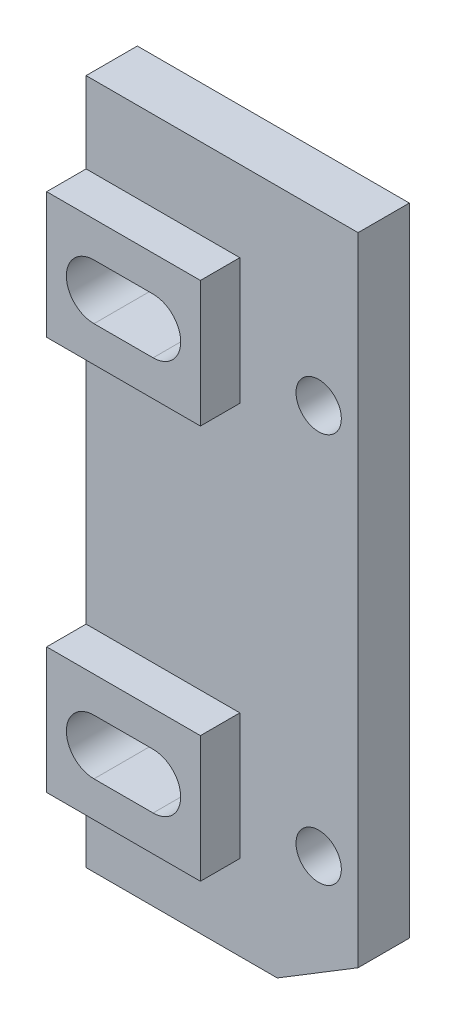
ISO-10303-21;
HEADER;
FILE_DESCRIPTION(('STEP AP214'),'2;1');
FILE_NAME('part.step','',(''),(''),'','','');
FILE_SCHEMA(('AUTOMOTIVE_DESIGN { 1 0 10303 214 1 1 1 1 }'));
ENDSEC;
DATA;
#1=APPLICATION_CONTEXT('core data for automotive mechanical design processes');
#2=APPLICATION_PROTOCOL_DEFINITION('international standard','automotive_design',2000,#1);
#3=PRODUCT_CONTEXT('',#1,'mechanical');
#4=PRODUCT('Part','Part','',(#3));
#5=PRODUCT_RELATED_PRODUCT_CATEGORY('part','',(#4));
#6=PRODUCT_DEFINITION_FORMATION('','',#4);
#7=PRODUCT_DEFINITION_CONTEXT('part definition',#1,'design');
#8=PRODUCT_DEFINITION('design','',#6,#7);
#9=PRODUCT_DEFINITION_SHAPE('','',#8);
#10=(LENGTH_UNIT() NAMED_UNIT(*) SI_UNIT(.MILLI.,.METRE.));
#11=(NAMED_UNIT(*) PLANE_ANGLE_UNIT() SI_UNIT($,.RADIAN.));
#12=(NAMED_UNIT(*) SI_UNIT($,.STERADIAN.) SOLID_ANGLE_UNIT());
#13=UNCERTAINTY_MEASURE_WITH_UNIT(LENGTH_MEASURE(1.E-05),#10,'distance_accuracy_value','');
#14=(GEOMETRIC_REPRESENTATION_CONTEXT(3) GLOBAL_UNCERTAINTY_ASSIGNED_CONTEXT((#13)) GLOBAL_UNIT_ASSIGNED_CONTEXT((#10,
#11,#12)) REPRESENTATION_CONTEXT('',''));
#15=CARTESIAN_POINT('',(0.,0.,0.));
#16=DIRECTION('',(0.,0.,1.));
#17=DIRECTION('',(1.,0.,0.));
#18=AXIS2_PLACEMENT_3D('',#15,#16,#17);
#19=CARTESIAN_POINT('',(0.,0.,2.6));
#20=DIRECTION('',(0.,0.,1.));
#21=DIRECTION('',(1.,0.,0.));
#22=AXIS2_PLACEMENT_3D('',#19,#20,#21);
#23=PLANE('',#22);
#24=CARTESIAN_POINT('',(36.8,2.2,2.6));
#25=DIRECTION('',(0.,0.,1.));
#26=DIRECTION('',(1.,0.,0.));
#27=AXIS2_PLACEMENT_3D('',#24,#25,#26);
#28=CIRCLE('',#27,1.15);
#29=CARTESIAN_POINT('',(37.95,2.2,2.6));
#30=VERTEX_POINT('',#29);
#31=EDGE_CURVE('E299',#30,#30,#28,.T.);
#32=ORIENTED_EDGE('',*,*,#31,.F.);
#33=EDGE_LOOP('',(#32));
#34=FACE_BOUND('',#33,.T.);
#35=CARTESIAN_POINT('',(36.8,-17.6,2.6));
#36=DIRECTION('',(0.,0.,1.));
#37=DIRECTION('',(1.,0.,0.));
#38=AXIS2_PLACEMENT_3D('',#35,#36,#37);
#39=CIRCLE('',#38,1.15);
#40=CARTESIAN_POINT('',(37.95,-17.6,2.6));
#41=VERTEX_POINT('',#40);
#42=EDGE_CURVE('E305',#41,#41,#39,.T.);
#43=ORIENTED_EDGE('',*,*,#42,.F.);
#44=EDGE_LOOP('',(#43));
#45=FACE_BOUND('',#44,.T.);
#46=DIRECTION('',(0.,1.,0.));
#47=VECTOR('',#46,1.);
#48=CARTESIAN_POINT('',(32.8,0.3,2.6));
#49=LINE('',#48,#47);
#50=CARTESIAN_POINT('',(32.8,0.3,2.6));
#51=VERTEX_POINT('',#50);
#52=CARTESIAN_POINT('',(32.8,6.7,2.6));
#53=VERTEX_POINT('',#52);
#54=EDGE_CURVE('E58',#51,#53,#49,.T.);
#55=ORIENTED_EDGE('',*,*,#54,.F.);
#56=DIRECTION('',(1.,0.,0.));
#57=VECTOR('',#56,1.);
#58=CARTESIAN_POINT('',(25.,0.3,2.6));
#59=LINE('',#58,#57);
#60=CARTESIAN_POINT('',(25.,0.3,2.6));
#61=VERTEX_POINT('',#60);
#62=EDGE_CURVE('E211',#61,#51,#59,.T.);
#63=ORIENTED_EDGE('',*,*,#62,.F.);
#64=DIRECTION('',(0.,-1.,0.));
#65=VECTOR('',#64,1.);
#66=CARTESIAN_POINT('',(25.,10.8,2.6));
#67=LINE('',#66,#65);
#68=CARTESIAN_POINT('',(25.,-13.3,2.6));
#69=VERTEX_POINT('',#68);
#70=EDGE_CURVE('E314',#61,#69,#67,.T.);
#71=ORIENTED_EDGE('',*,*,#70,.T.);
#72=DIRECTION('',(-1.,0.,0.));
#73=VECTOR('',#72,1.);
#74=CARTESIAN_POINT('',(32.8,-13.3,2.6));
#75=LINE('',#74,#73);
#76=CARTESIAN_POINT('',(32.8,-13.3,2.6));
#77=VERTEX_POINT('',#76);
#78=EDGE_CURVE('E237',#77,#69,#75,.T.);
#79=ORIENTED_EDGE('',*,*,#78,.F.);
#80=DIRECTION('',(0.,1.,0.));
#81=VECTOR('',#80,1.);
#82=CARTESIAN_POINT('',(32.8,-19.7,2.6));
#83=LINE('',#82,#81);
#84=CARTESIAN_POINT('',(32.8,-19.7,2.6));
#85=VERTEX_POINT('',#84);
#86=EDGE_CURVE('E246',#85,#77,#83,.T.);
#87=ORIENTED_EDGE('',*,*,#86,.F.);
#88=DIRECTION('',(1.,0.,0.));
#89=VECTOR('',#88,1.);
#90=CARTESIAN_POINT('',(25.,-19.7,2.6));
#91=LINE('',#90,#89);
#92=CARTESIAN_POINT('',(25.,-19.7,2.6));
#93=VERTEX_POINT('',#92);
#94=EDGE_CURVE('E232',#93,#85,#91,.T.);
#95=ORIENTED_EDGE('',*,*,#94,.F.);
#96=CARTESIAN_POINT('',(25.,-24.,2.6));
#97=VERTEX_POINT('',#96);
#98=EDGE_CURVE('E315',#93,#97,#67,.T.);
#99=ORIENTED_EDGE('',*,*,#98,.T.);
#100=DIRECTION('',(1.,0.,0.));
#101=VECTOR('',#100,1.);
#102=CARTESIAN_POINT('',(25.,-24.,2.6));
#103=LINE('',#102,#101);
#104=CARTESIAN_POINT('',(34.7,-24.,2.6));
#105=VERTEX_POINT('',#104);
#106=EDGE_CURVE('E313',#97,#105,#103,.T.);
#107=ORIENTED_EDGE('',*,*,#106,.T.);
#108=DIRECTION('',(0.853796175794035,0.520607424264657,0.));
#109=VECTOR('',#108,1.);
#110=CARTESIAN_POINT('',(34.7,-24.,2.6));
#111=LINE('',#110,#109);
#112=CARTESIAN_POINT('',(38.8,-21.5,2.6));
#113=VERTEX_POINT('',#112);
#114=EDGE_CURVE('E317',#105,#113,#111,.T.);
#115=ORIENTED_EDGE('',*,*,#114,.T.);
#116=DIRECTION('',(0.,1.,0.));
#117=VECTOR('',#116,1.);
#118=CARTESIAN_POINT('',(38.8,-21.5,2.6));
#119=LINE('',#118,#117);
#120=CARTESIAN_POINT('',(38.8,10.8,2.6));
#121=VERTEX_POINT('',#120);
#122=EDGE_CURVE('E319',#113,#121,#119,.T.);
#123=ORIENTED_EDGE('',*,*,#122,.T.);
#124=DIRECTION('',(-1.,0.,0.));
#125=VECTOR('',#124,1.);
#126=CARTESIAN_POINT('',(38.8,10.8,2.6));
#127=LINE('',#126,#125);
#128=CARTESIAN_POINT('',(25.,10.8,2.6));
#129=VERTEX_POINT('',#128);
#130=EDGE_CURVE('E321',#121,#129,#127,.T.);
#131=ORIENTED_EDGE('',*,*,#130,.T.);
#132=CARTESIAN_POINT('',(25.,6.7,2.6));
#133=VERTEX_POINT('',#132);
#134=EDGE_CURVE('E311',#129,#133,#67,.T.);
#135=ORIENTED_EDGE('',*,*,#134,.T.);
#136=DIRECTION('',(-1.,0.,0.));
#137=VECTOR('',#136,1.);
#138=CARTESIAN_POINT('',(32.8,6.7,2.6));
#139=LINE('',#138,#137);
#140=EDGE_CURVE('E63',#53,#133,#139,.T.);
#141=ORIENTED_EDGE('',*,*,#140,.F.);
#142=EDGE_LOOP('',(#55,#63,#71,#79,#87,#95,#99,#107,#115,#123,#131,#135,#141));
#143=FACE_BOUND('',#142,.T.);
#144=ADVANCED_FACE('F43',(#34,#45,#143),#23,.T.);
#145=CARTESIAN_POINT('',(0.,0.,0.));
#146=DIRECTION('',(0.,0.,1.));
#147=DIRECTION('',(1.,0.,0.));
#148=AXIS2_PLACEMENT_3D('',#145,#146,#147);
#149=PLANE('',#148);
#150=CARTESIAN_POINT('',(27.4,-16.5,0.));
#151=DIRECTION('',(0.,0.,1.));
#152=DIRECTION('',(1.,0.,0.));
#153=AXIS2_PLACEMENT_3D('',#150,#151,#152);
#154=CIRCLE('',#153,1.4);
#155=CARTESIAN_POINT('',(27.4,-15.1,0.));
#156=VERTEX_POINT('',#155);
#157=CARTESIAN_POINT('',(27.4,-17.9,0.));
#158=VERTEX_POINT('',#157);
#159=EDGE_CURVE('E276',#156,#158,#154,.T.);
#160=ORIENTED_EDGE('',*,*,#159,.T.);
#161=DIRECTION('',(1.,0.,0.));
#162=VECTOR('',#161,1.);
#163=CARTESIAN_POINT('',(27.4,-17.9,0.));
#164=LINE('',#163,#162);
#165=CARTESIAN_POINT('',(30.4,-17.9,0.));
#166=VERTEX_POINT('',#165);
#167=EDGE_CURVE('E279',#158,#166,#164,.T.);
#168=ORIENTED_EDGE('',*,*,#167,.T.);
#169=CARTESIAN_POINT('',(30.4,-16.5,0.));
#170=DIRECTION('',(0.,0.,1.));
#171=DIRECTION('',(1.,0.,0.));
#172=AXIS2_PLACEMENT_3D('',#169,#170,#171);
#173=CIRCLE('',#172,1.4);
#174=CARTESIAN_POINT('',(30.4,-15.1,0.));
#175=VERTEX_POINT('',#174);
#176=EDGE_CURVE('E282',#166,#175,#173,.T.);
#177=ORIENTED_EDGE('',*,*,#176,.T.);
#178=DIRECTION('',(-1.,0.,0.));
#179=VECTOR('',#178,1.);
#180=CARTESIAN_POINT('',(30.4,-15.1,0.));
#181=LINE('',#180,#179);
#182=EDGE_CURVE('E285',#175,#156,#181,.T.);
#183=ORIENTED_EDGE('',*,*,#182,.T.);
#184=EDGE_LOOP('',(#160,#168,#177,#183));
#185=FACE_BOUND('',#184,.T.);
#186=DIRECTION('',(0.,-1.,0.));
#187=VECTOR('',#186,1.);
#188=CARTESIAN_POINT('',(25.,10.8,0.));
#189=LINE('',#188,#187);
#190=CARTESIAN_POINT('',(25.,10.8,0.));
#191=VERTEX_POINT('',#190);
#192=CARTESIAN_POINT('',(25.,-24.,0.));
#193=VERTEX_POINT('',#192);
#194=EDGE_CURVE('E308',#191,#193,#189,.T.);
#195=ORIENTED_EDGE('',*,*,#194,.F.);
#196=DIRECTION('',(-1.,0.,0.));
#197=VECTOR('',#196,1.);
#198=CARTESIAN_POINT('',(38.8,10.8,0.));
#199=LINE('',#198,#197);
#200=CARTESIAN_POINT('',(38.8,10.8,0.));
#201=VERTEX_POINT('',#200);
#202=EDGE_CURVE('E332',#201,#191,#199,.T.);
#203=ORIENTED_EDGE('',*,*,#202,.F.);
#204=DIRECTION('',(0.,1.,0.));
#205=VECTOR('',#204,1.);
#206=CARTESIAN_POINT('',(38.8,-21.5,0.));
#207=LINE('',#206,#205);
#208=CARTESIAN_POINT('',(38.8,-21.5,0.));
#209=VERTEX_POINT('',#208);
#210=EDGE_CURVE('E330',#209,#201,#207,.T.);
#211=ORIENTED_EDGE('',*,*,#210,.F.);
#212=DIRECTION('',(0.853796175794035,0.520607424264657,0.));
#213=VECTOR('',#212,1.);
#214=CARTESIAN_POINT('',(34.7,-24.,0.));
#215=LINE('',#214,#213);
#216=CARTESIAN_POINT('',(34.7,-24.,0.));
#217=VERTEX_POINT('',#216);
#218=EDGE_CURVE('E328',#217,#209,#215,.T.);
#219=ORIENTED_EDGE('',*,*,#218,.F.);
#220=DIRECTION('',(1.,0.,0.));
#221=VECTOR('',#220,1.);
#222=CARTESIAN_POINT('',(25.,-24.,0.));
#223=LINE('',#222,#221);
#224=EDGE_CURVE('E326',#193,#217,#223,.T.);
#225=ORIENTED_EDGE('',*,*,#224,.F.);
#226=EDGE_LOOP('',(#195,#203,#211,#219,#225));
#227=FACE_BOUND('',#226,.T.);
#228=CARTESIAN_POINT('',(36.8,-17.6,0.));
#229=DIRECTION('',(0.,0.,1.));
#230=DIRECTION('',(1.,0.,0.));
#231=AXIS2_PLACEMENT_3D('',#228,#229,#230);
#232=CIRCLE('',#231,1.15);
#233=CARTESIAN_POINT('',(37.95,-17.6,0.));
#234=VERTEX_POINT('',#233);
#235=EDGE_CURVE('E302',#234,#234,#232,.T.);
#236=ORIENTED_EDGE('',*,*,#235,.T.);
#237=EDGE_LOOP('',(#236));
#238=FACE_BOUND('',#237,.T.);
#239=CARTESIAN_POINT('',(36.8,2.2,0.));
#240=DIRECTION('',(0.,0.,1.));
#241=DIRECTION('',(1.,0.,0.));
#242=AXIS2_PLACEMENT_3D('',#239,#240,#241);
#243=CIRCLE('',#242,1.15);
#244=CARTESIAN_POINT('',(37.95,2.2,0.));
#245=VERTEX_POINT('',#244);
#246=EDGE_CURVE('E298',#245,#245,#243,.T.);
#247=ORIENTED_EDGE('',*,*,#246,.T.);
#248=EDGE_LOOP('',(#247));
#249=FACE_BOUND('',#248,.T.);
#250=CARTESIAN_POINT('',(27.4,3.5,0.));
#251=DIRECTION('',(0.,0.,1.));
#252=DIRECTION('',(1.,0.,0.));
#253=AXIS2_PLACEMENT_3D('',#250,#251,#252);
#254=CIRCLE('',#253,1.4);
#255=CARTESIAN_POINT('',(27.4,4.9,0.));
#256=VERTEX_POINT('',#255);
#257=CARTESIAN_POINT('',(27.4,2.1,0.));
#258=VERTEX_POINT('',#257);
#259=EDGE_CURVE('E262',#256,#258,#254,.T.);
#260=ORIENTED_EDGE('',*,*,#259,.T.);
#261=DIRECTION('',(1.,0.,0.));
#262=VECTOR('',#261,1.);
#263=CARTESIAN_POINT('',(27.4,2.1,0.));
#264=LINE('',#263,#262);
#265=CARTESIAN_POINT('',(30.4,2.1,0.));
#266=VERTEX_POINT('',#265);
#267=EDGE_CURVE('E265',#258,#266,#264,.T.);
#268=ORIENTED_EDGE('',*,*,#267,.T.);
#269=CARTESIAN_POINT('',(30.4,3.5,0.));
#270=DIRECTION('',(0.,0.,1.));
#271=DIRECTION('',(1.,0.,0.));
#272=AXIS2_PLACEMENT_3D('',#269,#270,#271);
#273=CIRCLE('',#272,1.4);
#274=CARTESIAN_POINT('',(30.4,4.9,0.));
#275=VERTEX_POINT('',#274);
#276=EDGE_CURVE('E268',#266,#275,#273,.T.);
#277=ORIENTED_EDGE('',*,*,#276,.T.);
#278=DIRECTION('',(-1.,0.,0.));
#279=VECTOR('',#278,1.);
#280=CARTESIAN_POINT('',(30.4,4.9,0.));
#281=LINE('',#280,#279);
#282=EDGE_CURVE('E193',#275,#256,#281,.T.);
#283=ORIENTED_EDGE('',*,*,#282,.T.);
#284=EDGE_LOOP('',(#260,#268,#277,#283));
#285=FACE_BOUND('',#284,.T.);
#286=ADVANCED_FACE('F353',(#185,#227,#238,#249,#285),#149,.F.);
#287=CARTESIAN_POINT('',(25.,10.8,2.6));
#288=DIRECTION('',(1.,0.,0.));
#289=DIRECTION('',(0.,0.,-1.));
#290=AXIS2_PLACEMENT_3D('',#287,#288,#289);
#291=PLANE('',#290);
#292=ORIENTED_EDGE('',*,*,#194,.T.);
#293=DIRECTION('',(0.,0.,-1.));
#294=VECTOR('',#293,1.);
#295=CARTESIAN_POINT('',(25.,-24.,2.6));
#296=LINE('',#295,#294);
#297=EDGE_CURVE('E11',#97,#193,#296,.T.);
#298=ORIENTED_EDGE('',*,*,#297,.F.);
#299=ORIENTED_EDGE('',*,*,#98,.F.);
#300=DIRECTION('',(0.,0.,-1.));
#301=VECTOR('',#300,1.);
#302=CARTESIAN_POINT('',(25.,-19.7,4.6));
#303=LINE('',#302,#301);
#304=CARTESIAN_POINT('',(25.,-19.7,4.6));
#305=VERTEX_POINT('',#304);
#306=EDGE_CURVE('E259',#305,#93,#303,.T.);
#307=ORIENTED_EDGE('',*,*,#306,.F.);
#308=DIRECTION('',(0.,-1.,0.));
#309=VECTOR('',#308,1.);
#310=CARTESIAN_POINT('',(25.,-13.3,4.6));
#311=LINE('',#310,#309);
#312=CARTESIAN_POINT('',(25.,-13.3,4.6));
#313=VERTEX_POINT('',#312);
#314=EDGE_CURVE('E233',#313,#305,#311,.T.);
#315=ORIENTED_EDGE('',*,*,#314,.F.);
#316=DIRECTION('',(0.,0.,-1.));
#317=VECTOR('',#316,1.);
#318=CARTESIAN_POINT('',(25.,-13.3,4.6));
#319=LINE('',#318,#317);
#320=EDGE_CURVE('E243',#313,#69,#319,.T.);
#321=ORIENTED_EDGE('',*,*,#320,.T.);
#322=ORIENTED_EDGE('',*,*,#70,.F.);
#323=DIRECTION('',(0.,0.,-1.));
#324=VECTOR('',#323,1.);
#325=CARTESIAN_POINT('',(25.,0.3,4.6));
#326=LINE('',#325,#324);
#327=CARTESIAN_POINT('',(25.,0.3,4.6));
#328=VERTEX_POINT('',#327);
#329=EDGE_CURVE('E394',#328,#61,#326,.T.);
#330=ORIENTED_EDGE('',*,*,#329,.F.);
#331=DIRECTION('',(0.,-1.,0.));
#332=VECTOR('',#331,1.);
#333=CARTESIAN_POINT('',(25.,6.7,4.6));
#334=LINE('',#333,#332);
#335=CARTESIAN_POINT('',(25.,6.7,4.6));
#336=VERTEX_POINT('',#335);
#337=EDGE_CURVE('E215',#336,#328,#334,.T.);
#338=ORIENTED_EDGE('',*,*,#337,.F.);
#339=DIRECTION('',(0.,0.,-1.));
#340=VECTOR('',#339,1.);
#341=CARTESIAN_POINT('',(25.,6.7,4.6));
#342=LINE('',#341,#340);
#343=EDGE_CURVE('E373',#336,#133,#342,.T.);
#344=ORIENTED_EDGE('',*,*,#343,.T.);
#345=ORIENTED_EDGE('',*,*,#134,.F.);
#346=DIRECTION('',(0.,0.,-1.));
#347=VECTOR('',#346,1.);
#348=CARTESIAN_POINT('',(25.,10.8,2.6));
#349=LINE('',#348,#347);
#350=EDGE_CURVE('E323',#129,#191,#349,.T.);
#351=ORIENTED_EDGE('',*,*,#350,.T.);
#352=EDGE_LOOP('',(#292,#298,#299,#307,#315,#321,#322,#330,#338,#344,#345,#351));
#353=FACE_BOUND('',#352,.T.);
#354=ADVANCED_FACE('F45',(#353),#291,.F.);
#355=CARTESIAN_POINT('',(25.,-24.,2.6));
#356=DIRECTION('',(0.,1.,0.));
#357=DIRECTION('',(0.,0.,1.));
#358=AXIS2_PLACEMENT_3D('',#355,#356,#357);
#359=PLANE('',#358);
#360=ORIENTED_EDGE('',*,*,#224,.T.);
#361=DIRECTION('',(0.,0.,-1.));
#362=VECTOR('',#361,1.);
#363=CARTESIAN_POINT('',(34.7,-24.,2.6));
#364=LINE('',#363,#362);
#365=EDGE_CURVE('E51',#105,#217,#364,.T.);
#366=ORIENTED_EDGE('',*,*,#365,.F.);
#367=ORIENTED_EDGE('',*,*,#106,.F.);
#368=ORIENTED_EDGE('',*,*,#297,.T.);
#369=EDGE_LOOP('',(#360,#366,#367,#368));
#370=FACE_BOUND('',#369,.T.);
#371=ADVANCED_FACE('F367',(#370),#359,.F.);
#372=CARTESIAN_POINT('',(34.7,-24.,2.6));
#373=DIRECTION('',(-0.520607424264657,0.853796175794035,0.));
#374=DIRECTION('',(-0.853796175794035,-0.520607424264657,0.));
#375=AXIS2_PLACEMENT_3D('',#372,#373,#374);
#376=PLANE('',#375);
#377=ORIENTED_EDGE('',*,*,#218,.T.);
#378=DIRECTION('',(0.,0.,-1.));
#379=VECTOR('',#378,1.);
#380=CARTESIAN_POINT('',(38.8,-21.5,2.6));
#381=LINE('',#380,#379);
#382=EDGE_CURVE('E339',#113,#209,#381,.T.);
#383=ORIENTED_EDGE('',*,*,#382,.F.);
#384=ORIENTED_EDGE('',*,*,#114,.F.);
#385=ORIENTED_EDGE('',*,*,#365,.T.);
#386=EDGE_LOOP('',(#377,#383,#384,#385));
#387=FACE_BOUND('',#386,.T.);
#388=ADVANCED_FACE('F346',(#387),#376,.F.);
#389=CARTESIAN_POINT('',(38.8,-21.5,2.6));
#390=DIRECTION('',(-1.,0.,0.));
#391=DIRECTION('',(0.,0.,1.));
#392=AXIS2_PLACEMENT_3D('',#389,#390,#391);
#393=PLANE('',#392);
#394=ORIENTED_EDGE('',*,*,#210,.T.);
#395=DIRECTION('',(0.,0.,-1.));
#396=VECTOR('',#395,1.);
#397=CARTESIAN_POINT('',(38.8,10.8,2.6));
#398=LINE('',#397,#396);
#399=EDGE_CURVE('E336',#121,#201,#398,.T.);
#400=ORIENTED_EDGE('',*,*,#399,.F.);
#401=ORIENTED_EDGE('',*,*,#122,.F.);
#402=ORIENTED_EDGE('',*,*,#382,.T.);
#403=EDGE_LOOP('',(#394,#400,#401,#402));
#404=FACE_BOUND('',#403,.T.);
#405=ADVANCED_FACE('F358',(#404),#393,.F.);
#406=CARTESIAN_POINT('',(38.8,10.8,2.6));
#407=DIRECTION('',(0.,-1.,0.));
#408=DIRECTION('',(0.,0.,-1.));
#409=AXIS2_PLACEMENT_3D('',#406,#407,#408);
#410=PLANE('',#409);
#411=ORIENTED_EDGE('',*,*,#202,.T.);
#412=ORIENTED_EDGE('',*,*,#350,.F.);
#413=ORIENTED_EDGE('',*,*,#130,.F.);
#414=ORIENTED_EDGE('',*,*,#399,.T.);
#415=EDGE_LOOP('',(#411,#412,#413,#414));
#416=FACE_BOUND('',#415,.T.);
#417=ADVANCED_FACE('F362',(#416),#410,.F.);
#418=CARTESIAN_POINT('',(36.8,-17.6,2.6));
#419=DIRECTION('',(0.,0.,-1.));
#420=DIRECTION('',(-1.,0.,0.));
#421=AXIS2_PLACEMENT_3D('',#418,#419,#420);
#422=CYLINDRICAL_SURFACE('',#421,1.15);
#423=ORIENTED_EDGE('',*,*,#42,.T.);
#424=EDGE_LOOP('',(#423));
#425=FACE_BOUND('',#424,.T.);
#426=ORIENTED_EDGE('',*,*,#235,.F.);
#427=EDGE_LOOP('',(#426));
#428=FACE_BOUND('',#427,.T.);
#429=ADVANCED_FACE('F440',(#425,#428),#422,.F.);
#430=CARTESIAN_POINT('',(36.8,2.2,2.6));
#431=DIRECTION('',(0.,0.,-1.));
#432=DIRECTION('',(-1.,0.,0.));
#433=AXIS2_PLACEMENT_3D('',#430,#431,#432);
#434=CYLINDRICAL_SURFACE('',#433,1.15);
#435=ORIENTED_EDGE('',*,*,#31,.T.);
#436=EDGE_LOOP('',(#435));
#437=FACE_BOUND('',#436,.T.);
#438=ORIENTED_EDGE('',*,*,#246,.F.);
#439=EDGE_LOOP('',(#438));
#440=FACE_BOUND('',#439,.T.);
#441=ADVANCED_FACE('F462',(#437,#440),#434,.F.);
#442=CARTESIAN_POINT('',(27.4,-16.5,2.6));
#443=DIRECTION('',(0.,0.,-1.));
#444=DIRECTION('',(-1.,0.,0.));
#445=AXIS2_PLACEMENT_3D('',#442,#443,#444);
#446=CYLINDRICAL_SURFACE('',#445,1.4);
#447=ORIENTED_EDGE('',*,*,#159,.F.);
#448=DIRECTION('',(0.,0.,-1.));
#449=VECTOR('',#448,1.);
#450=CARTESIAN_POINT('',(27.4,-15.1,2.6));
#451=LINE('',#450,#449);
#452=CARTESIAN_POINT('',(27.4,-15.1,4.6));
#453=VERTEX_POINT('',#452);
#454=EDGE_CURVE('E288',#453,#156,#451,.T.);
#455=ORIENTED_EDGE('',*,*,#454,.F.);
#456=CARTESIAN_POINT('',(27.4,-16.5,4.6));
#457=DIRECTION('',(0.,0.,1.));
#458=DIRECTION('',(1.,0.,0.));
#459=AXIS2_PLACEMENT_3D('',#456,#457,#458);
#460=CIRCLE('',#459,1.4);
#461=CARTESIAN_POINT('',(27.4,-17.9,4.6));
#462=VERTEX_POINT('',#461);
#463=EDGE_CURVE('E220',#453,#462,#460,.T.);
#464=ORIENTED_EDGE('',*,*,#463,.T.);
#465=DIRECTION('',(0.,0.,-1.));
#466=VECTOR('',#465,1.);
#467=CARTESIAN_POINT('',(27.4,-17.9,2.6));
#468=LINE('',#467,#466);
#469=EDGE_CURVE('E295',#462,#158,#468,.T.);
#470=ORIENTED_EDGE('',*,*,#469,.T.);
#471=EDGE_LOOP('',(#447,#455,#464,#470));
#472=FACE_BOUND('',#471,.T.);
#473=ADVANCED_FACE('F458',(#472),#446,.F.);
#474=CARTESIAN_POINT('',(27.4,-17.9,2.6));
#475=DIRECTION('',(0.,1.,0.));
#476=DIRECTION('',(0.,0.,1.));
#477=AXIS2_PLACEMENT_3D('',#474,#475,#476);
#478=PLANE('',#477);
#479=ORIENTED_EDGE('',*,*,#167,.F.);
#480=ORIENTED_EDGE('',*,*,#469,.F.);
#481=DIRECTION('',(1.,0.,0.));
#482=VECTOR('',#481,1.);
#483=CARTESIAN_POINT('',(27.4,-17.9,4.6));
#484=LINE('',#483,#482);
#485=CARTESIAN_POINT('',(30.4,-17.9,4.6));
#486=VERTEX_POINT('',#485);
#487=EDGE_CURVE('E223',#462,#486,#484,.T.);
#488=ORIENTED_EDGE('',*,*,#487,.T.);
#489=DIRECTION('',(0.,0.,-1.));
#490=VECTOR('',#489,1.);
#491=CARTESIAN_POINT('',(30.4,-17.9,2.6));
#492=LINE('',#491,#490);
#493=EDGE_CURVE('E293',#486,#166,#492,.T.);
#494=ORIENTED_EDGE('',*,*,#493,.T.);
#495=EDGE_LOOP('',(#479,#480,#488,#494));
#496=FACE_BOUND('',#495,.T.);
#497=ADVANCED_FACE('F461',(#496),#478,.T.);
#498=CARTESIAN_POINT('',(30.4,-16.5,2.6));
#499=DIRECTION('',(0.,0.,-1.));
#500=DIRECTION('',(-1.,0.,0.));
#501=AXIS2_PLACEMENT_3D('',#498,#499,#500);
#502=CYLINDRICAL_SURFACE('',#501,1.4);
#503=ORIENTED_EDGE('',*,*,#176,.F.);
#504=ORIENTED_EDGE('',*,*,#493,.F.);
#505=CARTESIAN_POINT('',(30.4,-16.5,4.6));
#506=DIRECTION('',(0.,0.,1.));
#507=DIRECTION('',(1.,0.,0.));
#508=AXIS2_PLACEMENT_3D('',#505,#506,#507);
#509=CIRCLE('',#508,1.4);
#510=CARTESIAN_POINT('',(30.4,-15.1,4.6));
#511=VERTEX_POINT('',#510);
#512=EDGE_CURVE('E226',#486,#511,#509,.T.);
#513=ORIENTED_EDGE('',*,*,#512,.T.);
#514=DIRECTION('',(0.,0.,-1.));
#515=VECTOR('',#514,1.);
#516=CARTESIAN_POINT('',(30.4,-15.1,2.6));
#517=LINE('',#516,#515);
#518=EDGE_CURVE('E291',#511,#175,#517,.T.);
#519=ORIENTED_EDGE('',*,*,#518,.T.);
#520=EDGE_LOOP('',(#503,#504,#513,#519));
#521=FACE_BOUND('',#520,.T.);
#522=ADVANCED_FACE('F471',(#521),#502,.F.);
#523=CARTESIAN_POINT('',(30.4,-15.1,2.6));
#524=DIRECTION('',(0.,-1.,0.));
#525=DIRECTION('',(0.,0.,-1.));
#526=AXIS2_PLACEMENT_3D('',#523,#524,#525);
#527=PLANE('',#526);
#528=ORIENTED_EDGE('',*,*,#182,.F.);
#529=ORIENTED_EDGE('',*,*,#518,.F.);
#530=DIRECTION('',(-1.,0.,0.));
#531=VECTOR('',#530,1.);
#532=CARTESIAN_POINT('',(30.4,-15.1,4.6));
#533=LINE('',#532,#531);
#534=EDGE_CURVE('E229',#511,#453,#533,.T.);
#535=ORIENTED_EDGE('',*,*,#534,.T.);
#536=ORIENTED_EDGE('',*,*,#454,.T.);
#537=EDGE_LOOP('',(#528,#529,#535,#536));
#538=FACE_BOUND('',#537,.T.);
#539=ADVANCED_FACE('F480',(#538),#527,.T.);
#540=CARTESIAN_POINT('',(27.4,3.5,2.6));
#541=DIRECTION('',(0.,0.,-1.));
#542=DIRECTION('',(-1.,0.,0.));
#543=AXIS2_PLACEMENT_3D('',#540,#541,#542);
#544=CYLINDRICAL_SURFACE('',#543,1.4);
#545=ORIENTED_EDGE('',*,*,#259,.F.);
#546=DIRECTION('',(0.,0.,-1.));
#547=VECTOR('',#546,1.);
#548=CARTESIAN_POINT('',(27.4,4.9,2.6));
#549=LINE('',#548,#547);
#550=CARTESIAN_POINT('',(27.4,4.9,4.6));
#551=VERTEX_POINT('',#550);
#552=EDGE_CURVE('E198',#551,#256,#549,.T.);
#553=ORIENTED_EDGE('',*,*,#552,.F.);
#554=CARTESIAN_POINT('',(27.4,3.5,4.6));
#555=DIRECTION('',(0.,0.,1.));
#556=DIRECTION('',(1.,0.,0.));
#557=AXIS2_PLACEMENT_3D('',#554,#555,#556);
#558=CIRCLE('',#557,1.4);
#559=CARTESIAN_POINT('',(27.4,2.1,4.6));
#560=VERTEX_POINT('',#559);
#561=EDGE_CURVE('E210',#551,#560,#558,.T.);
#562=ORIENTED_EDGE('',*,*,#561,.T.);
#563=DIRECTION('',(0.,0.,-1.));
#564=VECTOR('',#563,1.);
#565=CARTESIAN_POINT('',(27.4,2.1,2.6));
#566=LINE('',#565,#564);
#567=EDGE_CURVE('E273',#560,#258,#566,.T.);
#568=ORIENTED_EDGE('',*,*,#567,.T.);
#569=EDGE_LOOP('',(#545,#553,#562,#568));
#570=FACE_BOUND('',#569,.T.);
#571=ADVANCED_FACE('F489',(#570),#544,.F.);
#572=CARTESIAN_POINT('',(27.4,2.1,2.6));
#573=DIRECTION('',(0.,1.,0.));
#574=DIRECTION('',(0.,0.,1.));
#575=AXIS2_PLACEMENT_3D('',#572,#573,#574);
#576=PLANE('',#575);
#577=ORIENTED_EDGE('',*,*,#267,.F.);
#578=ORIENTED_EDGE('',*,*,#567,.F.);
#579=DIRECTION('',(1.,0.,0.));
#580=VECTOR('',#579,1.);
#581=CARTESIAN_POINT('',(27.4,2.1,4.6));
#582=LINE('',#581,#580);
#583=CARTESIAN_POINT('',(30.4,2.1,4.6));
#584=VERTEX_POINT('',#583);
#585=EDGE_CURVE('E206',#560,#584,#582,.T.);
#586=ORIENTED_EDGE('',*,*,#585,.T.);
#587=DIRECTION('',(0.,0.,-1.));
#588=VECTOR('',#587,1.);
#589=CARTESIAN_POINT('',(30.4,2.1,2.6));
#590=LINE('',#589,#588);
#591=EDGE_CURVE('E197',#584,#266,#590,.T.);
#592=ORIENTED_EDGE('',*,*,#591,.T.);
#593=EDGE_LOOP('',(#577,#578,#586,#592));
#594=FACE_BOUND('',#593,.T.);
#595=ADVANCED_FACE('F498',(#594),#576,.T.);
#596=CARTESIAN_POINT('',(30.4,3.5,2.6));
#597=DIRECTION('',(0.,0.,-1.));
#598=DIRECTION('',(-1.,0.,0.));
#599=AXIS2_PLACEMENT_3D('',#596,#597,#598);
#600=CYLINDRICAL_SURFACE('',#599,1.4);
#601=ORIENTED_EDGE('',*,*,#276,.F.);
#602=ORIENTED_EDGE('',*,*,#591,.F.);
#603=CARTESIAN_POINT('',(30.4,3.5,4.6));
#604=DIRECTION('',(0.,0.,1.));
#605=DIRECTION('',(1.,0.,0.));
#606=AXIS2_PLACEMENT_3D('',#603,#604,#605);
#607=CIRCLE('',#606,1.4);
#608=CARTESIAN_POINT('',(30.4,4.9,4.6));
#609=VERTEX_POINT('',#608);
#610=EDGE_CURVE('E201',#584,#609,#607,.T.);
#611=ORIENTED_EDGE('',*,*,#610,.T.);
#612=DIRECTION('',(0.,0.,-1.));
#613=VECTOR('',#612,1.);
#614=CARTESIAN_POINT('',(30.4,4.9,2.6));
#615=LINE('',#614,#613);
#616=EDGE_CURVE('E185',#609,#275,#615,.T.);
#617=ORIENTED_EDGE('',*,*,#616,.T.);
#618=EDGE_LOOP('',(#601,#602,#611,#617));
#619=FACE_BOUND('',#618,.T.);
#620=ADVANCED_FACE('F202',(#619),#600,.F.);
#621=CARTESIAN_POINT('',(30.4,4.9,2.6));
#622=DIRECTION('',(0.,-1.,0.));
#623=DIRECTION('',(0.,0.,-1.));
#624=AXIS2_PLACEMENT_3D('',#621,#622,#623);
#625=PLANE('',#624);
#626=ORIENTED_EDGE('',*,*,#282,.F.);
#627=ORIENTED_EDGE('',*,*,#616,.F.);
#628=DIRECTION('',(-1.,0.,0.));
#629=VECTOR('',#628,1.);
#630=CARTESIAN_POINT('',(30.4,4.9,4.6));
#631=LINE('',#630,#629);
#632=EDGE_CURVE('E190',#609,#551,#631,.T.);
#633=ORIENTED_EDGE('',*,*,#632,.T.);
#634=ORIENTED_EDGE('',*,*,#552,.T.);
#635=EDGE_LOOP('',(#626,#627,#633,#634));
#636=FACE_BOUND('',#635,.T.);
#637=ADVANCED_FACE('F187',(#636),#625,.T.);
#638=CARTESIAN_POINT('',(0.,0.,4.6));
#639=DIRECTION('',(0.,0.,1.));
#640=DIRECTION('',(1.,0.,0.));
#641=AXIS2_PLACEMENT_3D('',#638,#639,#640);
#642=PLANE('',#641);
#643=ORIENTED_EDGE('',*,*,#314,.T.);
#644=DIRECTION('',(1.,0.,0.));
#645=VECTOR('',#644,1.);
#646=CARTESIAN_POINT('',(25.,-19.7,4.6));
#647=LINE('',#646,#645);
#648=CARTESIAN_POINT('',(32.8,-19.7,4.6));
#649=VERTEX_POINT('',#648);
#650=EDGE_CURVE('E236',#305,#649,#647,.T.);
#651=ORIENTED_EDGE('',*,*,#650,.T.);
#652=DIRECTION('',(0.,1.,0.));
#653=VECTOR('',#652,1.);
#654=CARTESIAN_POINT('',(32.8,-19.7,4.6));
#655=LINE('',#654,#653);
#656=CARTESIAN_POINT('',(32.8,-13.3,4.6));
#657=VERTEX_POINT('',#656);
#658=EDGE_CURVE('E239',#649,#657,#655,.T.);
#659=ORIENTED_EDGE('',*,*,#658,.T.);
#660=DIRECTION('',(-1.,0.,0.));
#661=VECTOR('',#660,1.);
#662=CARTESIAN_POINT('',(32.8,-13.3,4.6));
#663=LINE('',#662,#661);
#664=EDGE_CURVE('E241',#657,#313,#663,.T.);
#665=ORIENTED_EDGE('',*,*,#664,.T.);
#666=EDGE_LOOP('',(#643,#651,#659,#665));
#667=FACE_BOUND('',#666,.T.);
#668=ORIENTED_EDGE('',*,*,#487,.F.);
#669=ORIENTED_EDGE('',*,*,#463,.F.);
#670=ORIENTED_EDGE('',*,*,#534,.F.);
#671=ORIENTED_EDGE('',*,*,#512,.F.);
#672=EDGE_LOOP('',(#668,#669,#670,#671));
#673=FACE_BOUND('',#672,.T.);
#674=ADVANCED_FACE('F410',(#667,#673),#642,.T.);
#675=CARTESIAN_POINT('',(25.,-19.7,4.6));
#676=DIRECTION('',(0.,1.,0.));
#677=DIRECTION('',(0.,0.,1.));
#678=AXIS2_PLACEMENT_3D('',#675,#676,#677);
#679=PLANE('',#678);
#680=ORIENTED_EDGE('',*,*,#94,.T.);
#681=DIRECTION('',(0.,0.,-1.));
#682=VECTOR('',#681,1.);
#683=CARTESIAN_POINT('',(32.8,-19.7,4.6));
#684=LINE('',#683,#682);
#685=EDGE_CURVE('E256',#649,#85,#684,.T.);
#686=ORIENTED_EDGE('',*,*,#685,.F.);
#687=ORIENTED_EDGE('',*,*,#650,.F.);
#688=ORIENTED_EDGE('',*,*,#306,.T.);
#689=EDGE_LOOP('',(#680,#686,#687,#688));
#690=FACE_BOUND('',#689,.T.);
#691=ADVANCED_FACE('F417',(#690),#679,.F.);
#692=CARTESIAN_POINT('',(32.8,-19.7,4.6));
#693=DIRECTION('',(-1.,0.,0.));
#694=DIRECTION('',(0.,0.,1.));
#695=AXIS2_PLACEMENT_3D('',#692,#693,#694);
#696=PLANE('',#695);
#697=ORIENTED_EDGE('',*,*,#86,.T.);
#698=DIRECTION('',(0.,0.,-1.));
#699=VECTOR('',#698,1.);
#700=CARTESIAN_POINT('',(32.8,-13.3,4.6));
#701=LINE('',#700,#699);
#702=EDGE_CURVE('E253',#657,#77,#701,.T.);
#703=ORIENTED_EDGE('',*,*,#702,.F.);
#704=ORIENTED_EDGE('',*,*,#658,.F.);
#705=ORIENTED_EDGE('',*,*,#685,.T.);
#706=EDGE_LOOP('',(#697,#703,#704,#705));
#707=FACE_BOUND('',#706,.T.);
#708=ADVANCED_FACE('F415',(#707),#696,.F.);
#709=CARTESIAN_POINT('',(32.8,-13.3,4.6));
#710=DIRECTION('',(0.,-1.,0.));
#711=DIRECTION('',(0.,0.,-1.));
#712=AXIS2_PLACEMENT_3D('',#709,#710,#711);
#713=PLANE('',#712);
#714=ORIENTED_EDGE('',*,*,#78,.T.);
#715=ORIENTED_EDGE('',*,*,#320,.F.);
#716=ORIENTED_EDGE('',*,*,#664,.F.);
#717=ORIENTED_EDGE('',*,*,#702,.T.);
#718=EDGE_LOOP('',(#714,#715,#716,#717));
#719=FACE_BOUND('',#718,.T.);
#720=ADVANCED_FACE('F405',(#719),#713,.F.);
#721=CARTESIAN_POINT('',(0.,0.,4.6));
#722=DIRECTION('',(0.,0.,1.));
#723=DIRECTION('',(1.,0.,0.));
#724=AXIS2_PLACEMENT_3D('',#721,#722,#723);
#725=PLANE('',#724);
#726=ORIENTED_EDGE('',*,*,#337,.T.);
#727=DIRECTION('',(1.,0.,0.));
#728=VECTOR('',#727,1.);
#729=CARTESIAN_POINT('',(25.,0.3,4.6));
#730=LINE('',#729,#728);
#731=CARTESIAN_POINT('',(32.8,0.3,4.6));
#732=VERTEX_POINT('',#731);
#733=EDGE_CURVE('E390',#328,#732,#730,.T.);
#734=ORIENTED_EDGE('',*,*,#733,.T.);
#735=DIRECTION('',(0.,1.,0.));
#736=VECTOR('',#735,1.);
#737=CARTESIAN_POINT('',(32.8,0.3,4.6));
#738=LINE('',#737,#736);
#739=CARTESIAN_POINT('',(32.8,6.7,4.6));
#740=VERTEX_POINT('',#739);
#741=EDGE_CURVE('E381',#732,#740,#738,.T.);
#742=ORIENTED_EDGE('',*,*,#741,.T.);
#743=DIRECTION('',(-1.,0.,0.));
#744=VECTOR('',#743,1.);
#745=CARTESIAN_POINT('',(32.8,6.7,4.6));
#746=LINE('',#745,#744);
#747=EDGE_CURVE('E378',#740,#336,#746,.T.);
#748=ORIENTED_EDGE('',*,*,#747,.T.);
#749=EDGE_LOOP('',(#726,#734,#742,#748));
#750=FACE_BOUND('',#749,.T.);
#751=ORIENTED_EDGE('',*,*,#585,.F.);
#752=ORIENTED_EDGE('',*,*,#561,.F.);
#753=ORIENTED_EDGE('',*,*,#632,.F.);
#754=ORIENTED_EDGE('',*,*,#610,.F.);
#755=EDGE_LOOP('',(#751,#752,#753,#754));
#756=FACE_BOUND('',#755,.T.);
#757=ADVANCED_FACE('F208',(#750,#756),#725,.T.);
#758=CARTESIAN_POINT('',(25.,0.3,4.6));
#759=DIRECTION('',(0.,1.,0.));
#760=DIRECTION('',(0.,0.,1.));
#761=AXIS2_PLACEMENT_3D('',#758,#759,#760);
#762=PLANE('',#761);
#763=ORIENTED_EDGE('',*,*,#62,.T.);
#764=DIRECTION('',(0.,0.,-1.));
#765=VECTOR('',#764,1.);
#766=CARTESIAN_POINT('',(32.8,0.3,4.6));
#767=LINE('',#766,#765);
#768=EDGE_CURVE('E384',#732,#51,#767,.T.);
#769=ORIENTED_EDGE('',*,*,#768,.F.);
#770=ORIENTED_EDGE('',*,*,#733,.F.);
#771=ORIENTED_EDGE('',*,*,#329,.T.);
#772=EDGE_LOOP('',(#763,#769,#770,#771));
#773=FACE_BOUND('',#772,.T.);
#774=ADVANCED_FACE('F402',(#773),#762,.F.);
#775=CARTESIAN_POINT('',(32.8,0.3,4.6));
#776=DIRECTION('',(-1.,0.,0.));
#777=DIRECTION('',(0.,0.,1.));
#778=AXIS2_PLACEMENT_3D('',#775,#776,#777);
#779=PLANE('',#778);
#780=ORIENTED_EDGE('',*,*,#54,.T.);
#781=DIRECTION('',(0.,0.,-1.));
#782=VECTOR('',#781,1.);
#783=CARTESIAN_POINT('',(32.8,6.7,4.6));
#784=LINE('',#783,#782);
#785=EDGE_CURVE('E379',#740,#53,#784,.T.);
#786=ORIENTED_EDGE('',*,*,#785,.F.);
#787=ORIENTED_EDGE('',*,*,#741,.F.);
#788=ORIENTED_EDGE('',*,*,#768,.T.);
#789=EDGE_LOOP('',(#780,#786,#787,#788));
#790=FACE_BOUND('',#789,.T.);
#791=ADVANCED_FACE('F400',(#790),#779,.F.);
#792=CARTESIAN_POINT('',(32.8,6.7,4.6));
#793=DIRECTION('',(0.,-1.,0.));
#794=DIRECTION('',(0.,0.,-1.));
#795=AXIS2_PLACEMENT_3D('',#792,#793,#794);
#796=PLANE('',#795);
#797=ORIENTED_EDGE('',*,*,#140,.T.);
#798=ORIENTED_EDGE('',*,*,#343,.F.);
#799=ORIENTED_EDGE('',*,*,#747,.F.);
#800=ORIENTED_EDGE('',*,*,#785,.T.);
#801=EDGE_LOOP('',(#797,#798,#799,#800));
#802=FACE_BOUND('',#801,.T.);
#803=ADVANCED_FACE('F570',(#802),#796,.F.);
#804=CLOSED_SHELL('',(#144,#286,#354,#371,#388,#405,#417,#429,#441,#473,#497,#522,#539,#571,
#595,#620,#637,#674,#691,#708,#720,#757,#774,#791,#803));
#805=MANIFOLD_SOLID_BREP('B2',#804);
#806=ADVANCED_BREP_SHAPE_REPRESENTATION('',(#18,#805),#14);
#807=SHAPE_DEFINITION_REPRESENTATION(#9,#806);
ENDSEC;
END-ISO-10303-21;
